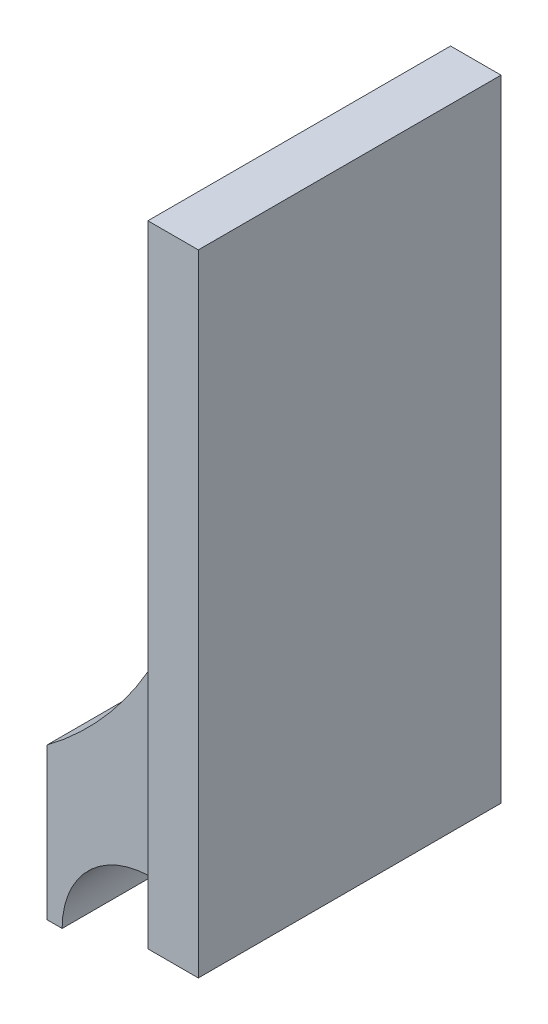
ISO-10303-21;
HEADER;
FILE_DESCRIPTION(('STEP AP214'),'2;1');
FILE_NAME('part.step','',(''),(''),'','','');
FILE_SCHEMA(('AUTOMOTIVE_DESIGN { 1 0 10303 214 1 1 1 1 }'));
ENDSEC;
DATA;
#1=APPLICATION_CONTEXT('core data for automotive mechanical design processes');
#2=APPLICATION_PROTOCOL_DEFINITION('international standard','automotive_design',2000,#1);
#3=PRODUCT_CONTEXT('',#1,'mechanical');
#4=PRODUCT('Part','Part','',(#3));
#5=PRODUCT_RELATED_PRODUCT_CATEGORY('part','',(#4));
#6=PRODUCT_DEFINITION_FORMATION('','',#4);
#7=PRODUCT_DEFINITION_CONTEXT('part definition',#1,'design');
#8=PRODUCT_DEFINITION('design','',#6,#7);
#9=PRODUCT_DEFINITION_SHAPE('','',#8);
#10=(LENGTH_UNIT() NAMED_UNIT(*) SI_UNIT(.MILLI.,.METRE.));
#11=(NAMED_UNIT(*) PLANE_ANGLE_UNIT() SI_UNIT($,.RADIAN.));
#12=(NAMED_UNIT(*) SI_UNIT($,.STERADIAN.) SOLID_ANGLE_UNIT());
#13=UNCERTAINTY_MEASURE_WITH_UNIT(LENGTH_MEASURE(1.E-05),#10,'distance_accuracy_value','');
#14=(GEOMETRIC_REPRESENTATION_CONTEXT(3) GLOBAL_UNCERTAINTY_ASSIGNED_CONTEXT((#13)) GLOBAL_UNIT_ASSIGNED_CONTEXT((#10,
#11,#12)) REPRESENTATION_CONTEXT('',''));
#15=CARTESIAN_POINT('',(0.,0.,0.));
#16=DIRECTION('',(0.,0.,1.));
#17=DIRECTION('',(1.,0.,0.));
#18=AXIS2_PLACEMENT_3D('',#15,#16,#17);
#19=CARTESIAN_POINT('',(2.,-12.5,-6.));
#20=DIRECTION('',(0.,0.,1.));
#21=DIRECTION('',(1.,0.,0.));
#22=AXIS2_PLACEMENT_3D('',#19,#20,#21);
#23=PLANE('',#22);
#24=DIRECTION('',(-1.,0.,0.));
#25=VECTOR('',#24,1.);
#26=CARTESIAN_POINT('',(2.,-12.5,-6.));
#27=LINE('',#26,#25);
#28=CARTESIAN_POINT('',(2.,-12.5,-6.));
#29=VERTEX_POINT('',#28);
#30=CARTESIAN_POINT('',(0.,-12.5,-6.));
#31=VERTEX_POINT('',#30);
#32=EDGE_CURVE('E147',#29,#31,#27,.T.);
#33=ORIENTED_EDGE('',*,*,#32,.T.);
#34=DIRECTION('',(0.,1.,0.));
#35=VECTOR('',#34,1.);
#36=CARTESIAN_POINT('',(0.,-12.5,-6.));
#37=LINE('',#36,#35);
#38=CARTESIAN_POINT('',(0.,12.5,-6.));
#39=VERTEX_POINT('',#38);
#40=EDGE_CURVE('E123',#31,#39,#37,.T.);
#41=ORIENTED_EDGE('',*,*,#40,.T.);
#42=DIRECTION('',(-1.,0.,0.));
#43=VECTOR('',#42,1.);
#44=CARTESIAN_POINT('',(2.,12.5,-6.));
#45=LINE('',#44,#43);
#46=CARTESIAN_POINT('',(2.,12.5,-6.));
#47=VERTEX_POINT('',#46);
#48=EDGE_CURVE('E164',#47,#39,#45,.T.);
#49=ORIENTED_EDGE('',*,*,#48,.F.);
#50=DIRECTION('',(0.,1.,0.));
#51=VECTOR('',#50,1.);
#52=CARTESIAN_POINT('',(2.,-12.5,-6.));
#53=LINE('',#52,#51);
#54=EDGE_CURVE('E138',#29,#47,#53,.T.);
#55=ORIENTED_EDGE('',*,*,#54,.F.);
#56=EDGE_LOOP('',(#33,#41,#49,#55));
#57=FACE_BOUND('',#56,.T.);
#58=ADVANCED_FACE('F33',(#57),#23,.F.);
#59=CARTESIAN_POINT('',(2.,-12.5,6.));
#60=DIRECTION('',(0.,0.,-1.));
#61=DIRECTION('',(-1.,0.,0.));
#62=AXIS2_PLACEMENT_3D('',#59,#60,#61);
#63=PLANE('',#62);
#64=DIRECTION('',(0.,-1.,0.));
#65=VECTOR('',#64,1.);
#66=CARTESIAN_POINT('',(0.,-12.5,6.));
#67=LINE('',#66,#65);
#68=CARTESIAN_POINT('',(0.,12.5,6.));
#69=VERTEX_POINT('',#68);
#70=CARTESIAN_POINT('',(0.,-12.5,6.));
#71=VERTEX_POINT('',#70);
#72=EDGE_CURVE('E150',#69,#71,#67,.T.);
#73=ORIENTED_EDGE('',*,*,#72,.T.);
#74=DIRECTION('',(-1.,0.,0.));
#75=VECTOR('',#74,1.);
#76=CARTESIAN_POINT('',(2.,-12.5,6.));
#77=LINE('',#76,#75);
#78=CARTESIAN_POINT('',(2.,-12.5,6.));
#79=VERTEX_POINT('',#78);
#80=EDGE_CURVE('E158',#79,#71,#77,.T.);
#81=ORIENTED_EDGE('',*,*,#80,.F.);
#82=DIRECTION('',(0.,-1.,0.));
#83=VECTOR('',#82,1.);
#84=CARTESIAN_POINT('',(2.,-12.5,6.));
#85=LINE('',#84,#83);
#86=CARTESIAN_POINT('',(2.,12.5,6.));
#87=VERTEX_POINT('',#86);
#88=EDGE_CURVE('E144',#87,#79,#85,.T.);
#89=ORIENTED_EDGE('',*,*,#88,.F.);
#90=DIRECTION('',(-1.,0.,0.));
#91=VECTOR('',#90,1.);
#92=CARTESIAN_POINT('',(2.,12.5,6.));
#93=LINE('',#92,#91);
#94=EDGE_CURVE('E161',#87,#69,#93,.T.);
#95=ORIENTED_EDGE('',*,*,#94,.T.);
#96=EDGE_LOOP('',(#73,#81,#89,#95));
#97=FACE_BOUND('',#96,.T.);
#98=ADVANCED_FACE('F191',(#97),#63,.F.);
#99=CARTESIAN_POINT('',(-15.,2.5,-24.9736659610103));
#100=DIRECTION('',(0.,0.,1.));
#101=DIRECTION('',(1.,0.,0.));
#102=AXIS2_PLACEMENT_3D('',#99,#100,#101);
#103=CYLINDRICAL_SURFACE('',#102,15.);
#104=DIRECTION('',(0.,0.,1.));
#105=VECTOR('',#104,1.);
#106=CARTESIAN_POINT('',(0.,2.5,-24.9736659610103));
#107=LINE('',#106,#105);
#108=CARTESIAN_POINT('',(0.,2.5,-4.));
#109=VERTEX_POINT('',#108);
#110=CARTESIAN_POINT('',(0.,2.5,4.));
#111=VERTEX_POINT('',#110);
#112=EDGE_CURVE('E115',#109,#111,#107,.T.);
#113=ORIENTED_EDGE('',*,*,#112,.F.);
#114=CARTESIAN_POINT('',(-15.,2.5,-4.));
#115=DIRECTION('',(0.,0.,-1.));
#116=DIRECTION('',(0.,1.,0.));
#117=AXIS2_PLACEMENT_3D('',#114,#115,#116);
#118=CIRCLE('',#117,15.);
#119=CARTESIAN_POINT('',(-6.,-9.5,-4.));
#120=VERTEX_POINT('',#119);
#121=EDGE_CURVE('E132',#109,#120,#118,.T.);
#122=ORIENTED_EDGE('',*,*,#121,.T.);
#123=DIRECTION('',(0.,0.,1.));
#124=VECTOR('',#123,1.);
#125=CARTESIAN_POINT('',(-6.,-9.5,-24.9736659610103));
#126=LINE('',#125,#124);
#127=CARTESIAN_POINT('',(-6.,-9.5,4.));
#128=VERTEX_POINT('',#127);
#129=EDGE_CURVE('E117',#120,#128,#126,.T.);
#130=ORIENTED_EDGE('',*,*,#129,.T.);
#131=CARTESIAN_POINT('',(-15.,2.5,4.));
#132=DIRECTION('',(0.,0.,1.));
#133=DIRECTION('',(0.,-1.,0.));
#134=AXIS2_PLACEMENT_3D('',#131,#132,#133);
#135=CIRCLE('',#134,15.);
#136=EDGE_CURVE('E47',#128,#111,#135,.T.);
#137=ORIENTED_EDGE('',*,*,#136,.T.);
#138=EDGE_LOOP('',(#113,#122,#130,#137));
#139=FACE_BOUND('',#138,.T.);
#140=ADVANCED_FACE('F113',(#139),#103,.F.);
#141=CARTESIAN_POINT('',(-1.86666666666667,-15.5,-24.9736659610103));
#142=DIRECTION('',(0.,0.,1.));
#143=DIRECTION('',(1.,0.,0.));
#144=AXIS2_PLACEMENT_3D('',#141,#142,#143);
#145=CYLINDRICAL_SURFACE('',#144,3.53333333333333);
#146=DIRECTION('',(0.,0.,1.));
#147=VECTOR('',#146,1.);
#148=CARTESIAN_POINT('',(-5.4,-15.5,-24.9736659610103));
#149=LINE('',#148,#147);
#150=CARTESIAN_POINT('',(-5.4,-15.5,-4.));
#151=VERTEX_POINT('',#150);
#152=CARTESIAN_POINT('',(-5.4,-15.5,4.));
#153=VERTEX_POINT('',#152);
#154=EDGE_CURVE('E124',#151,#153,#149,.T.);
#155=ORIENTED_EDGE('',*,*,#154,.F.);
#156=CARTESIAN_POINT('',(-1.86666666666667,-15.5,-4.));
#157=DIRECTION('',(0.,0.,-1.));
#158=DIRECTION('',(0.,1.,0.));
#159=AXIS2_PLACEMENT_3D('',#156,#157,#158);
#160=CIRCLE('',#159,3.53333333333333);
#161=CARTESIAN_POINT('',(0.,-12.5,-4.));
#162=VERTEX_POINT('',#161);
#163=EDGE_CURVE('E178',#151,#162,#160,.T.);
#164=ORIENTED_EDGE('',*,*,#163,.T.);
#165=DIRECTION('',(0.,0.,-1.));
#166=VECTOR('',#165,1.);
#167=CARTESIAN_POINT('',(0.,-12.5,6.));
#168=LINE('',#167,#166);
#169=CARTESIAN_POINT('',(0.,-12.5,4.));
#170=VERTEX_POINT('',#169);
#171=EDGE_CURVE('E155',#170,#162,#168,.T.);
#172=ORIENTED_EDGE('',*,*,#171,.F.);
#173=CARTESIAN_POINT('',(-1.86666666666667,-15.5,4.));
#174=DIRECTION('',(0.,0.,1.));
#175=DIRECTION('',(0.,-1.,0.));
#176=AXIS2_PLACEMENT_3D('',#173,#174,#175);
#177=CIRCLE('',#176,3.53333333333333);
#178=EDGE_CURVE('E103',#170,#153,#177,.T.);
#179=ORIENTED_EDGE('',*,*,#178,.T.);
#180=EDGE_LOOP('',(#155,#164,#172,#179));
#181=FACE_BOUND('',#180,.T.);
#182=ADVANCED_FACE('F183',(#181),#145,.F.);
#183=CARTESIAN_POINT('',(-6.,-15.5,-24.9736659610103));
#184=DIRECTION('',(0.,-1.,0.));
#185=DIRECTION('',(0.,0.,-1.));
#186=AXIS2_PLACEMENT_3D('',#183,#184,#185);
#187=PLANE('',#186);
#188=DIRECTION('',(0.,0.,1.));
#189=VECTOR('',#188,1.);
#190=CARTESIAN_POINT('',(-6.,-15.5,-24.9736659610103));
#191=LINE('',#190,#189);
#192=CARTESIAN_POINT('',(-6.,-15.5,-4.));
#193=VERTEX_POINT('',#192);
#194=CARTESIAN_POINT('',(-6.,-15.5,4.));
#195=VERTEX_POINT('',#194);
#196=EDGE_CURVE('E129',#193,#195,#191,.T.);
#197=ORIENTED_EDGE('',*,*,#196,.F.);
#198=DIRECTION('',(1.,0.,0.));
#199=VECTOR('',#198,1.);
#200=CARTESIAN_POINT('',(-6.,-15.5,-4.));
#201=LINE('',#200,#199);
#202=EDGE_CURVE('E55',#193,#151,#201,.T.);
#203=ORIENTED_EDGE('',*,*,#202,.T.);
#204=ORIENTED_EDGE('',*,*,#154,.T.);
#205=DIRECTION('',(-1.,0.,0.));
#206=VECTOR('',#205,1.);
#207=CARTESIAN_POINT('',(-6.,-15.5,4.));
#208=LINE('',#207,#206);
#209=EDGE_CURVE('E170',#153,#195,#208,.T.);
#210=ORIENTED_EDGE('',*,*,#209,.T.);
#211=EDGE_LOOP('',(#197,#203,#204,#210));
#212=FACE_BOUND('',#211,.T.);
#213=ADVANCED_FACE('F172',(#212),#187,.T.);
#214=CARTESIAN_POINT('',(-6.,-9.5,-24.9736659610103));
#215=DIRECTION('',(-1.,0.,0.));
#216=DIRECTION('',(0.,-1.,0.));
#217=AXIS2_PLACEMENT_3D('',#214,#215,#216);
#218=PLANE('',#217);
#219=ORIENTED_EDGE('',*,*,#129,.F.);
#220=DIRECTION('',(0.,-1.,0.));
#221=VECTOR('',#220,1.);
#222=CARTESIAN_POINT('',(-6.,-9.5,-4.));
#223=LINE('',#222,#221);
#224=EDGE_CURVE('E11',#120,#193,#223,.T.);
#225=ORIENTED_EDGE('',*,*,#224,.T.);
#226=ORIENTED_EDGE('',*,*,#196,.T.);
#227=DIRECTION('',(0.,1.,0.));
#228=VECTOR('',#227,1.);
#229=CARTESIAN_POINT('',(-6.,-9.5,4.));
#230=LINE('',#229,#228);
#231=EDGE_CURVE('E40',#195,#128,#230,.T.);
#232=ORIENTED_EDGE('',*,*,#231,.T.);
#233=EDGE_LOOP('',(#219,#225,#226,#232));
#234=FACE_BOUND('',#233,.T.);
#235=ADVANCED_FACE('F167',(#234),#218,.T.);
#236=CARTESIAN_POINT('',(2.,12.5,6.));
#237=DIRECTION('',(0.,-1.,0.));
#238=DIRECTION('',(0.,0.,-1.));
#239=AXIS2_PLACEMENT_3D('',#236,#237,#238);
#240=PLANE('',#239);
#241=DIRECTION('',(0.,0.,1.));
#242=VECTOR('',#241,1.);
#243=CARTESIAN_POINT('',(0.,12.5,6.));
#244=LINE('',#243,#242);
#245=EDGE_CURVE('E126',#39,#69,#244,.T.);
#246=ORIENTED_EDGE('',*,*,#245,.T.);
#247=ORIENTED_EDGE('',*,*,#94,.F.);
#248=DIRECTION('',(0.,0.,1.));
#249=VECTOR('',#248,1.);
#250=CARTESIAN_POINT('',(2.,12.5,6.));
#251=LINE('',#250,#249);
#252=EDGE_CURVE('E141',#47,#87,#251,.T.);
#253=ORIENTED_EDGE('',*,*,#252,.F.);
#254=ORIENTED_EDGE('',*,*,#48,.T.);
#255=EDGE_LOOP('',(#246,#247,#253,#254));
#256=FACE_BOUND('',#255,.T.);
#257=ADVANCED_FACE('F195',(#256),#240,.F.);
#258=CARTESIAN_POINT('',(2.,-12.5,6.));
#259=DIRECTION('',(0.,1.,0.));
#260=DIRECTION('',(0.,0.,1.));
#261=AXIS2_PLACEMENT_3D('',#258,#259,#260);
#262=PLANE('',#261);
#263=EDGE_CURVE('E142',#71,#170,#168,.T.);
#264=ORIENTED_EDGE('',*,*,#263,.T.);
#265=ORIENTED_EDGE('',*,*,#171,.T.);
#266=EDGE_CURVE('E152',#162,#31,#168,.T.);
#267=ORIENTED_EDGE('',*,*,#266,.T.);
#268=ORIENTED_EDGE('',*,*,#32,.F.);
#269=DIRECTION('',(0.,0.,-1.));
#270=VECTOR('',#269,1.);
#271=CARTESIAN_POINT('',(2.,-12.5,6.));
#272=LINE('',#271,#270);
#273=EDGE_CURVE('E146',#79,#29,#272,.T.);
#274=ORIENTED_EDGE('',*,*,#273,.F.);
#275=ORIENTED_EDGE('',*,*,#80,.T.);
#276=EDGE_LOOP('',(#264,#265,#267,#268,#274,#275));
#277=FACE_BOUND('',#276,.T.);
#278=ADVANCED_FACE('F186',(#277),#262,.F.);
#279=CARTESIAN_POINT('',(2.,0.,0.));
#280=DIRECTION('',(-1.,0.,0.));
#281=DIRECTION('',(0.,0.,1.));
#282=AXIS2_PLACEMENT_3D('',#279,#280,#281);
#283=PLANE('',#282);
#284=ORIENTED_EDGE('',*,*,#54,.T.);
#285=ORIENTED_EDGE('',*,*,#252,.T.);
#286=ORIENTED_EDGE('',*,*,#88,.T.);
#287=ORIENTED_EDGE('',*,*,#273,.T.);
#288=EDGE_LOOP('',(#284,#285,#286,#287));
#289=FACE_BOUND('',#288,.T.);
#290=ADVANCED_FACE('F201',(#289),#283,.F.);
#291=CARTESIAN_POINT('',(0.,0.,0.));
#292=DIRECTION('',(-1.,0.,0.));
#293=DIRECTION('',(0.,0.,1.));
#294=AXIS2_PLACEMENT_3D('',#291,#292,#293);
#295=PLANE('',#294);
#296=ORIENTED_EDGE('',*,*,#72,.F.);
#297=ORIENTED_EDGE('',*,*,#245,.F.);
#298=ORIENTED_EDGE('',*,*,#40,.F.);
#299=ORIENTED_EDGE('',*,*,#266,.F.);
#300=DIRECTION('',(0.,1.,0.));
#301=VECTOR('',#300,1.);
#302=CARTESIAN_POINT('',(0.,17.6977116704805,-4.));
#303=LINE('',#302,#301);
#304=EDGE_CURVE('E108',#162,#109,#303,.T.);
#305=ORIENTED_EDGE('',*,*,#304,.T.);
#306=ORIENTED_EDGE('',*,*,#112,.T.);
#307=DIRECTION('',(0.,-1.,0.));
#308=VECTOR('',#307,1.);
#309=CARTESIAN_POINT('',(0.,17.6977116704805,4.));
#310=LINE('',#309,#308);
#311=EDGE_CURVE('E100',#111,#170,#310,.T.);
#312=ORIENTED_EDGE('',*,*,#311,.T.);
#313=ORIENTED_EDGE('',*,*,#263,.F.);
#314=EDGE_LOOP('',(#296,#297,#298,#299,#305,#306,#312,#313));
#315=FACE_BOUND('',#314,.T.);
#316=ADVANCED_FACE('F121',(#315),#295,.T.);
#317=CARTESIAN_POINT('',(47.1505559334483,17.6977116704805,4.));
#318=DIRECTION('',(0.,0.,1.));
#319=DIRECTION('',(0.,-1.,0.));
#320=AXIS2_PLACEMENT_3D('',#317,#318,#319);
#321=PLANE('',#320);
#322=ORIENTED_EDGE('',*,*,#231,.F.);
#323=ORIENTED_EDGE('',*,*,#209,.F.);
#324=ORIENTED_EDGE('',*,*,#178,.F.);
#325=ORIENTED_EDGE('',*,*,#311,.F.);
#326=ORIENTED_EDGE('',*,*,#136,.F.);
#327=EDGE_LOOP('',(#322,#323,#324,#325,#326));
#328=FACE_BOUND('',#327,.T.);
#329=ADVANCED_FACE('F101',(#328),#321,.T.);
#330=CARTESIAN_POINT('',(47.1505559334483,17.6977116704805,-4.));
#331=DIRECTION('',(0.,0.,-1.));
#332=DIRECTION('',(0.,1.,0.));
#333=AXIS2_PLACEMENT_3D('',#330,#331,#332);
#334=PLANE('',#333);
#335=ORIENTED_EDGE('',*,*,#304,.F.);
#336=ORIENTED_EDGE('',*,*,#163,.F.);
#337=ORIENTED_EDGE('',*,*,#202,.F.);
#338=ORIENTED_EDGE('',*,*,#224,.F.);
#339=ORIENTED_EDGE('',*,*,#121,.F.);
#340=EDGE_LOOP('',(#335,#336,#337,#338,#339));
#341=FACE_BOUND('',#340,.T.);
#342=ADVANCED_FACE('F182',(#341),#334,.T.);
#343=CLOSED_SHELL('',(#58,#98,#140,#182,#213,#235,#257,#278,#290,#316,#329,#342));
#344=MANIFOLD_SOLID_BREP('B2',#343);
#345=ADVANCED_BREP_SHAPE_REPRESENTATION('',(#18,#344),#14);
#346=SHAPE_DEFINITION_REPRESENTATION(#9,#345);
ENDSEC;
END-ISO-10303-21;
